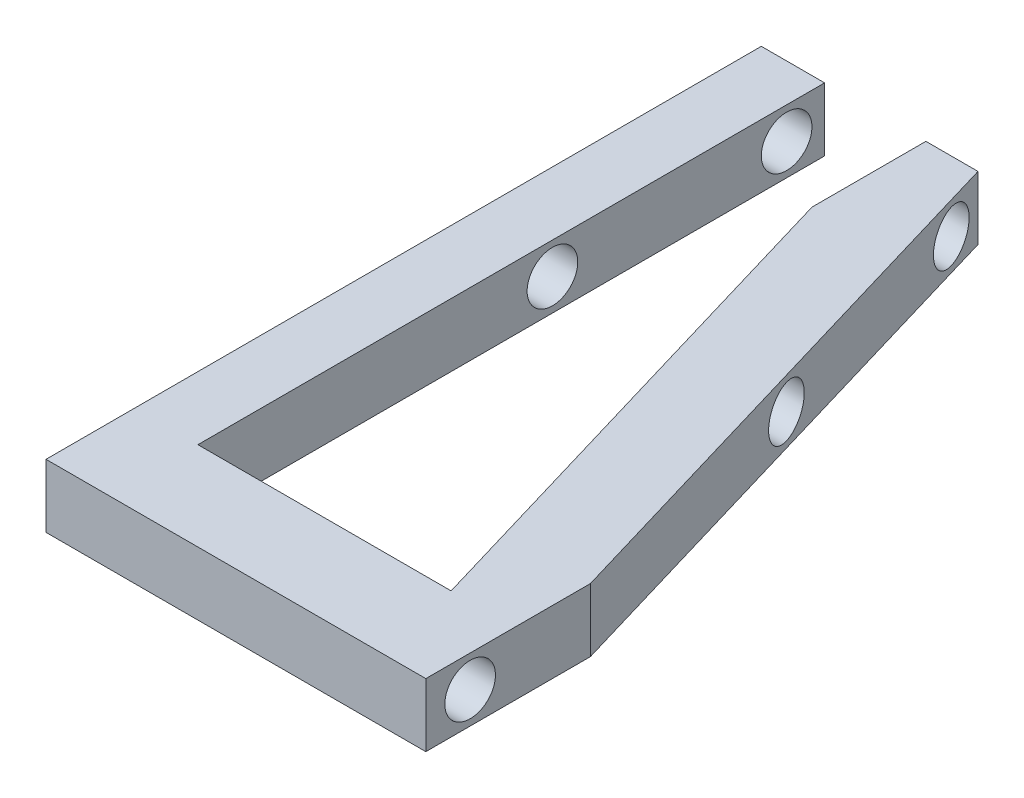
ISO-10303-21;
HEADER;
FILE_DESCRIPTION(('STEP AP214'),'2;1');
FILE_NAME('part.step','',(''),(''),'','','');
FILE_SCHEMA(('AUTOMOTIVE_DESIGN { 1 0 10303 214 1 1 1 1 }'));
ENDSEC;
DATA;
#1=APPLICATION_CONTEXT('core data for automotive mechanical design processes');
#2=APPLICATION_PROTOCOL_DEFINITION('international standard','automotive_design',2000,#1);
#3=PRODUCT_CONTEXT('',#1,'mechanical');
#4=PRODUCT('Part','Part','',(#3));
#5=PRODUCT_RELATED_PRODUCT_CATEGORY('part','',(#4));
#6=PRODUCT_DEFINITION_FORMATION('','',#4);
#7=PRODUCT_DEFINITION_CONTEXT('part definition',#1,'design');
#8=PRODUCT_DEFINITION('design','',#6,#7);
#9=PRODUCT_DEFINITION_SHAPE('','',#8);
#10=(LENGTH_UNIT() NAMED_UNIT(*) SI_UNIT(.MILLI.,.METRE.));
#11=(NAMED_UNIT(*) PLANE_ANGLE_UNIT() SI_UNIT($,.RADIAN.));
#12=(NAMED_UNIT(*) SI_UNIT($,.STERADIAN.) SOLID_ANGLE_UNIT());
#13=UNCERTAINTY_MEASURE_WITH_UNIT(LENGTH_MEASURE(1.E-05),#10,'distance_accuracy_value','');
#14=(GEOMETRIC_REPRESENTATION_CONTEXT(3) GLOBAL_UNCERTAINTY_ASSIGNED_CONTEXT((#13)) GLOBAL_UNIT_ASSIGNED_CONTEXT((#10,
#11,#12)) REPRESENTATION_CONTEXT('',''));
#15=CARTESIAN_POINT('',(0.,0.,0.));
#16=DIRECTION('',(0.,0.,1.));
#17=DIRECTION('',(1.,0.,0.));
#18=AXIS2_PLACEMENT_3D('',#15,#16,#17);
#19=CARTESIAN_POINT('',(-9.99905651846236,2.5,0.));
#20=DIRECTION('',(-1.,0.,0.));
#21=DIRECTION('',(0.,0.,1.));
#22=AXIS2_PLACEMENT_3D('',#19,#20,#21);
#23=PLANE('',#22);
#24=CARTESIAN_POINT('',(-9.99905651846236,0.,-28.));
#25=DIRECTION('',(-1.,0.,0.));
#26=DIRECTION('',(0.,0.,1.));
#27=AXIS2_PLACEMENT_3D('',#24,#25,#26);
#28=CIRCLE('',#27,2.);
#29=CARTESIAN_POINT('',(-9.99905651846236,0.,-26.));
#30=VERTEX_POINT('',#29);
#31=EDGE_CURVE('E188',#30,#30,#28,.T.);
#32=ORIENTED_EDGE('',*,*,#31,.T.);
#33=EDGE_LOOP('',(#32));
#34=FACE_BOUND('',#33,.T.);
#35=CARTESIAN_POINT('',(-9.99905651846236,0.,-46.5));
#36=DIRECTION('',(-1.,0.,0.));
#37=DIRECTION('',(0.,0.,1.));
#38=AXIS2_PLACEMENT_3D('',#35,#36,#37);
#39=CIRCLE('',#38,2.);
#40=CARTESIAN_POINT('',(-9.99905651846236,0.,-44.5));
#41=VERTEX_POINT('',#40);
#42=EDGE_CURVE('E147',#41,#41,#39,.T.);
#43=ORIENTED_EDGE('',*,*,#42,.T.);
#44=EDGE_LOOP('',(#43));
#45=FACE_BOUND('',#44,.T.);
#46=DIRECTION('',(0.,0.,-1.));
#47=VECTOR('',#46,1.);
#48=CARTESIAN_POINT('',(-9.99905651846236,-2.5,0.));
#49=LINE('',#48,#47);
#50=CARTESIAN_POINT('',(-9.99905651846236,-2.5,0.));
#51=VERTEX_POINT('',#50);
#52=CARTESIAN_POINT('',(-9.99905651846236,-2.5,-49.5));
#53=VERTEX_POINT('',#52);
#54=EDGE_CURVE('E143',#51,#53,#49,.T.);
#55=ORIENTED_EDGE('',*,*,#54,.T.);
#56=DIRECTION('',(0.,-1.,0.));
#57=VECTOR('',#56,1.);
#58=CARTESIAN_POINT('',(-9.99905651846236,2.5,-49.5));
#59=LINE('',#58,#57);
#60=CARTESIAN_POINT('',(-9.99905651846236,2.5,-49.5));
#61=VERTEX_POINT('',#60);
#62=EDGE_CURVE('E11',#61,#53,#59,.T.);
#63=ORIENTED_EDGE('',*,*,#62,.F.);
#64=DIRECTION('',(0.,0.,-1.));
#65=VECTOR('',#64,1.);
#66=CARTESIAN_POINT('',(-9.99905651846236,2.5,0.));
#67=LINE('',#66,#65);
#68=CARTESIAN_POINT('',(-9.99905651846236,2.5,0.));
#69=VERTEX_POINT('',#68);
#70=EDGE_CURVE('E162',#69,#61,#67,.T.);
#71=ORIENTED_EDGE('',*,*,#70,.F.);
#72=DIRECTION('',(0.,-1.,0.));
#73=VECTOR('',#72,1.);
#74=CARTESIAN_POINT('',(-9.99905651846236,2.5,0.));
#75=LINE('',#74,#73);
#76=EDGE_CURVE('E139',#69,#51,#75,.T.);
#77=ORIENTED_EDGE('',*,*,#76,.T.);
#78=EDGE_LOOP('',(#55,#63,#71,#77));
#79=FACE_BOUND('',#78,.T.);
#80=ADVANCED_FACE('F33',(#34,#45,#79),#23,.F.);
#81=CARTESIAN_POINT('',(-9.99905651846236,2.5,-49.5));
#82=DIRECTION('',(0.,0.,1.));
#83=DIRECTION('',(1.,0.,0.));
#84=AXIS2_PLACEMENT_3D('',#81,#82,#83);
#85=PLANE('',#84);
#86=DIRECTION('',(-1.,0.,0.));
#87=VECTOR('',#86,1.);
#88=CARTESIAN_POINT('',(-9.99905651846236,-2.5,-49.5));
#89=LINE('',#88,#87);
#90=CARTESIAN_POINT('',(-14.9990565184624,-2.5,-49.5));
#91=VERTEX_POINT('',#90);
#92=EDGE_CURVE('E146',#53,#91,#89,.T.);
#93=ORIENTED_EDGE('',*,*,#92,.T.);
#94=DIRECTION('',(0.,-1.,0.));
#95=VECTOR('',#94,1.);
#96=CARTESIAN_POINT('',(-14.9990565184624,2.5,-49.5));
#97=LINE('',#96,#95);
#98=CARTESIAN_POINT('',(-14.9990565184624,2.5,-49.5));
#99=VERTEX_POINT('',#98);
#100=EDGE_CURVE('E42',#99,#91,#97,.T.);
#101=ORIENTED_EDGE('',*,*,#100,.F.);
#102=DIRECTION('',(-1.,0.,0.));
#103=VECTOR('',#102,1.);
#104=CARTESIAN_POINT('',(-9.99905651846236,2.5,-49.5));
#105=LINE('',#104,#103);
#106=EDGE_CURVE('E100',#61,#99,#105,.T.);
#107=ORIENTED_EDGE('',*,*,#106,.F.);
#108=ORIENTED_EDGE('',*,*,#62,.T.);
#109=EDGE_LOOP('',(#93,#101,#107,#108));
#110=FACE_BOUND('',#109,.T.);
#111=ADVANCED_FACE('F237',(#110),#85,.F.);
#112=CARTESIAN_POINT('',(-14.9990565184624,2.5,-49.5));
#113=DIRECTION('',(1.,0.,0.));
#114=DIRECTION('',(0.,0.,-1.));
#115=AXIS2_PLACEMENT_3D('',#112,#113,#114);
#116=PLANE('',#115);
#117=CARTESIAN_POINT('',(-14.9990565184624,0.,-28.));
#118=DIRECTION('',(-1.,0.,0.));
#119=DIRECTION('',(0.,0.,1.));
#120=AXIS2_PLACEMENT_3D('',#117,#118,#119);
#121=CIRCLE('',#120,2.);
#122=CARTESIAN_POINT('',(-14.9990565184624,0.,-26.));
#123=VERTEX_POINT('',#122);
#124=EDGE_CURVE('E308',#123,#123,#121,.T.);
#125=ORIENTED_EDGE('',*,*,#124,.F.);
#126=EDGE_LOOP('',(#125));
#127=FACE_BOUND('',#126,.T.);
#128=CARTESIAN_POINT('',(-14.9990565184624,0.,3.5));
#129=DIRECTION('',(-1.,0.,0.));
#130=DIRECTION('',(0.,0.,1.));
#131=AXIS2_PLACEMENT_3D('',#128,#129,#130);
#132=CIRCLE('',#131,2.);
#133=CARTESIAN_POINT('',(-14.9990565184624,0.,5.5));
#134=VERTEX_POINT('',#133);
#135=EDGE_CURVE('E314',#134,#134,#132,.T.);
#136=ORIENTED_EDGE('',*,*,#135,.F.);
#137=EDGE_LOOP('',(#136));
#138=FACE_BOUND('',#137,.T.);
#139=CARTESIAN_POINT('',(-14.9990565184624,0.,-46.5));
#140=DIRECTION('',(-1.,0.,0.));
#141=DIRECTION('',(0.,0.,1.));
#142=AXIS2_PLACEMENT_3D('',#139,#140,#141);
#143=CIRCLE('',#142,2.);
#144=CARTESIAN_POINT('',(-14.9990565184624,0.,-44.5));
#145=VERTEX_POINT('',#144);
#146=EDGE_CURVE('E182',#145,#145,#143,.T.);
#147=ORIENTED_EDGE('',*,*,#146,.F.);
#148=EDGE_LOOP('',(#147));
#149=FACE_BOUND('',#148,.T.);
#150=DIRECTION('',(0.,0.,1.));
#151=VECTOR('',#150,1.);
#152=CARTESIAN_POINT('',(-14.9990565184624,-2.5,-49.5));
#153=LINE('',#152,#151);
#154=CARTESIAN_POINT('',(-14.9990565184624,-2.5,7.));
#155=VERTEX_POINT('',#154);
#156=EDGE_CURVE('E149',#91,#155,#153,.T.);
#157=ORIENTED_EDGE('',*,*,#156,.T.);
#158=DIRECTION('',(0.,-1.,0.));
#159=VECTOR('',#158,1.);
#160=CARTESIAN_POINT('',(-14.9990565184624,2.5,7.));
#161=LINE('',#160,#159);
#162=CARTESIAN_POINT('',(-14.9990565184624,2.5,7.));
#163=VERTEX_POINT('',#162);
#164=EDGE_CURVE('E175',#163,#155,#161,.T.);
#165=ORIENTED_EDGE('',*,*,#164,.F.);
#166=DIRECTION('',(0.,0.,1.));
#167=VECTOR('',#166,1.);
#168=CARTESIAN_POINT('',(-14.9990565184624,2.5,-49.5));
#169=LINE('',#168,#167);
#170=EDGE_CURVE('E201',#99,#163,#169,.T.);
#171=ORIENTED_EDGE('',*,*,#170,.F.);
#172=ORIENTED_EDGE('',*,*,#100,.T.);
#173=EDGE_LOOP('',(#157,#165,#171,#172));
#174=FACE_BOUND('',#173,.T.);
#175=ADVANCED_FACE('F242',(#127,#138,#149,#174),#116,.F.);
#176=CARTESIAN_POINT('',(-14.9990565184624,2.5,7.));
#177=DIRECTION('',(0.,0.,-1.));
#178=DIRECTION('',(-1.,0.,0.));
#179=AXIS2_PLACEMENT_3D('',#176,#177,#178);
#180=PLANE('',#179);
#181=DIRECTION('',(1.,0.,0.));
#182=VECTOR('',#181,1.);
#183=CARTESIAN_POINT('',(-14.9990565184624,-2.5,7.));
#184=LINE('',#183,#182);
#185=CARTESIAN_POINT('',(15.0009434815376,-2.5,7.));
#186=VERTEX_POINT('',#185);
#187=EDGE_CURVE('E151',#155,#186,#184,.T.);
#188=ORIENTED_EDGE('',*,*,#187,.T.);
#189=DIRECTION('',(0.,-1.,0.));
#190=VECTOR('',#189,1.);
#191=CARTESIAN_POINT('',(15.0009434815376,2.5,7.));
#192=LINE('',#191,#190);
#193=CARTESIAN_POINT('',(15.0009434815376,2.5,7.));
#194=VERTEX_POINT('',#193);
#195=EDGE_CURVE('E172',#194,#186,#192,.T.);
#196=ORIENTED_EDGE('',*,*,#195,.F.);
#197=DIRECTION('',(1.,0.,0.));
#198=VECTOR('',#197,1.);
#199=CARTESIAN_POINT('',(-14.9990565184624,2.5,7.));
#200=LINE('',#199,#198);
#201=EDGE_CURVE('E203',#163,#194,#200,.T.);
#202=ORIENTED_EDGE('',*,*,#201,.F.);
#203=ORIENTED_EDGE('',*,*,#164,.T.);
#204=EDGE_LOOP('',(#188,#196,#202,#203));
#205=FACE_BOUND('',#204,.T.);
#206=ADVANCED_FACE('F333',(#205),#180,.F.);
#207=CARTESIAN_POINT('',(15.0009434815376,2.5,7.));
#208=DIRECTION('',(-1.,0.,0.));
#209=DIRECTION('',(0.,0.,1.));
#210=AXIS2_PLACEMENT_3D('',#207,#208,#209);
#211=PLANE('',#210);
#212=CARTESIAN_POINT('',(15.0009434815376,0.,3.5));
#213=DIRECTION('',(-1.,0.,0.));
#214=DIRECTION('',(0.,0.,1.));
#215=AXIS2_PLACEMENT_3D('',#212,#213,#214);
#216=CIRCLE('',#215,2.);
#217=CARTESIAN_POINT('',(15.0009434815376,0.,5.50000000000001));
#218=VERTEX_POINT('',#217);
#219=EDGE_CURVE('E310',#218,#218,#216,.F.);
#220=ORIENTED_EDGE('',*,*,#219,.F.);
#221=EDGE_LOOP('',(#220));
#222=FACE_BOUND('',#221,.T.);
#223=DIRECTION('',(0.,0.,-1.));
#224=VECTOR('',#223,1.);
#225=CARTESIAN_POINT('',(15.0009434815376,-2.5,7.));
#226=LINE('',#225,#224);
#227=CARTESIAN_POINT('',(15.0009434815376,-2.5,-6.));
#228=VERTEX_POINT('',#227);
#229=EDGE_CURVE('E153',#186,#228,#226,.T.);
#230=ORIENTED_EDGE('',*,*,#229,.T.);
#231=DIRECTION('',(0.,-1.,0.));
#232=VECTOR('',#231,1.);
#233=CARTESIAN_POINT('',(15.0009434815376,2.5,-6.));
#234=LINE('',#233,#232);
#235=CARTESIAN_POINT('',(15.0009434815376,2.5,-6.));
#236=VERTEX_POINT('',#235);
#237=EDGE_CURVE('E169',#236,#228,#234,.T.);
#238=ORIENTED_EDGE('',*,*,#237,.F.);
#239=DIRECTION('',(0.,0.,-1.));
#240=VECTOR('',#239,1.);
#241=CARTESIAN_POINT('',(15.0009434815376,2.5,7.));
#242=LINE('',#241,#240);
#243=EDGE_CURVE('E205',#194,#236,#242,.T.);
#244=ORIENTED_EDGE('',*,*,#243,.F.);
#245=ORIENTED_EDGE('',*,*,#195,.T.);
#246=EDGE_LOOP('',(#230,#238,#244,#245));
#247=FACE_BOUND('',#246,.T.);
#248=ADVANCED_FACE('F324',(#222,#247),#211,.F.);
#249=CARTESIAN_POINT('',(15.0009434815376,2.5,-6.));
#250=DIRECTION('',(-0.958819734868195,0.,0.284015344703917));
#251=DIRECTION('',(0.284015344703917,0.,0.958819734868195));
#252=AXIS2_PLACEMENT_3D('',#249,#250,#251);
#253=PLANE('',#252);
#254=CARTESIAN_POINT('',(8.48424659237201,0.,-28.));
#255=DIRECTION('',(-0.958819734868195,0.,0.284015344703917));
#256=DIRECTION('',(-0.284015344703917,0.,-0.958819734868195));
#257=AXIS2_PLACEMENT_3D('',#254,#255,#256);
#258=ELLIPSE('',#257,2.0858978254916,2.);
#259=CARTESIAN_POINT('',(7.89181960244786,0.,-30.));
#260=VERTEX_POINT('',#259);
#261=EDGE_CURVE('E193',#260,#260,#258,.T.);
#262=ORIENTED_EDGE('',*,*,#261,.T.);
#263=EDGE_LOOP('',(#262));
#264=FACE_BOUND('',#263,.T.);
#265=CARTESIAN_POINT('',(3.00429693557366,0.,-46.5));
#266=DIRECTION('',(-0.958819734868195,0.,0.284015344703917));
#267=DIRECTION('',(-0.284015344703917,0.,-0.958819734868195));
#268=AXIS2_PLACEMENT_3D('',#265,#266,#267);
#269=ELLIPSE('',#268,2.0858978254916,2.);
#270=CARTESIAN_POINT('',(2.41186994564951,0.,-48.5));
#271=VERTEX_POINT('',#270);
#272=EDGE_CURVE('E181',#271,#271,#269,.T.);
#273=ORIENTED_EDGE('',*,*,#272,.T.);
#274=EDGE_LOOP('',(#273));
#275=FACE_BOUND('',#274,.T.);
#276=DIRECTION('',(-0.284015344703917,0.,-0.958819734868195));
#277=VECTOR('',#276,1.);
#278=CARTESIAN_POINT('',(15.0009434815376,-2.5,-6.));
#279=LINE('',#278,#277);
#280=CARTESIAN_POINT('',(2.11565645068743,-2.5,-49.5));
#281=VERTEX_POINT('',#280);
#282=EDGE_CURVE('E155',#228,#281,#279,.T.);
#283=ORIENTED_EDGE('',*,*,#282,.T.);
#284=DIRECTION('',(0.,-1.,0.));
#285=VECTOR('',#284,1.);
#286=CARTESIAN_POINT('',(2.11565645068743,2.5,-49.5));
#287=LINE('',#286,#285);
#288=CARTESIAN_POINT('',(2.11565645068743,2.5,-49.5));
#289=VERTEX_POINT('',#288);
#290=EDGE_CURVE('E166',#289,#281,#287,.T.);
#291=ORIENTED_EDGE('',*,*,#290,.F.);
#292=DIRECTION('',(-0.284015344703917,0.,-0.958819734868195));
#293=VECTOR('',#292,1.);
#294=CARTESIAN_POINT('',(15.0009434815376,2.5,-6.));
#295=LINE('',#294,#293);
#296=EDGE_CURVE('E207',#236,#289,#295,.T.);
#297=ORIENTED_EDGE('',*,*,#296,.F.);
#298=ORIENTED_EDGE('',*,*,#237,.T.);
#299=EDGE_LOOP('',(#283,#291,#297,#298));
#300=FACE_BOUND('',#299,.T.);
#301=ADVANCED_FACE('F213',(#264,#275,#300),#253,.F.);
#302=CARTESIAN_POINT('',(2.11565645068743,2.5,-49.5));
#303=DIRECTION('',(0.,0.,1.));
#304=DIRECTION('',(1.,0.,0.));
#305=AXIS2_PLACEMENT_3D('',#302,#303,#304);
#306=PLANE('',#305);
#307=DIRECTION('',(-1.,0.,0.));
#308=VECTOR('',#307,1.);
#309=CARTESIAN_POINT('',(2.11565645068743,-2.5,-49.5));
#310=LINE('',#309,#308);
#311=CARTESIAN_POINT('',(-1.99905651846236,-2.5,-49.5));
#312=VERTEX_POINT('',#311);
#313=EDGE_CURVE('E157',#281,#312,#310,.T.);
#314=ORIENTED_EDGE('',*,*,#313,.T.);
#315=DIRECTION('',(0.,-1.,0.));
#316=VECTOR('',#315,1.);
#317=CARTESIAN_POINT('',(-1.99905651846236,2.5,-49.5));
#318=LINE('',#317,#316);
#319=CARTESIAN_POINT('',(-1.99905651846236,2.5,-49.5));
#320=VERTEX_POINT('',#319);
#321=EDGE_CURVE('E134',#320,#312,#318,.T.);
#322=ORIENTED_EDGE('',*,*,#321,.F.);
#323=DIRECTION('',(-1.,0.,0.));
#324=VECTOR('',#323,1.);
#325=CARTESIAN_POINT('',(2.11565645068743,2.5,-49.5));
#326=LINE('',#325,#324);
#327=EDGE_CURVE('E125',#289,#320,#326,.T.);
#328=ORIENTED_EDGE('',*,*,#327,.F.);
#329=ORIENTED_EDGE('',*,*,#290,.T.);
#330=EDGE_LOOP('',(#314,#322,#328,#329));
#331=FACE_BOUND('',#330,.T.);
#332=ADVANCED_FACE('F217',(#331),#306,.F.);
#333=CARTESIAN_POINT('',(-1.99905651846236,2.5,-49.5));
#334=DIRECTION('',(1.,0.,0.));
#335=DIRECTION('',(0.,0.,-1.));
#336=AXIS2_PLACEMENT_3D('',#333,#334,#335);
#337=PLANE('',#336);
#338=CARTESIAN_POINT('',(-1.99905651846236,0.,-46.5));
#339=DIRECTION('',(1.,0.,0.));
#340=DIRECTION('',(0.,0.,-1.));
#341=AXIS2_PLACEMENT_3D('',#338,#339,#340);
#342=CIRCLE('',#341,2.);
#343=CARTESIAN_POINT('',(-1.99905651846236,0.,-48.5));
#344=VERTEX_POINT('',#343);
#345=EDGE_CURVE('E179',#344,#344,#342,.T.);
#346=ORIENTED_EDGE('',*,*,#345,.T.);
#347=EDGE_LOOP('',(#346));
#348=FACE_BOUND('',#347,.T.);
#349=DIRECTION('',(0.,0.,1.));
#350=VECTOR('',#349,1.);
#351=CARTESIAN_POINT('',(-1.99905651846236,-2.5,-49.5));
#352=LINE('',#351,#350);
#353=CARTESIAN_POINT('',(-1.99905651846236,-2.5,-40.5049507905132));
#354=VERTEX_POINT('',#353);
#355=EDGE_CURVE('E133',#312,#354,#352,.T.);
#356=ORIENTED_EDGE('',*,*,#355,.T.);
#357=DIRECTION('',(0.,-1.,0.));
#358=VECTOR('',#357,1.);
#359=CARTESIAN_POINT('',(-1.99905651846236,2.5,-40.5049507905132));
#360=LINE('',#359,#358);
#361=CARTESIAN_POINT('',(-1.99905651846236,2.5,-40.5049507905132));
#362=VERTEX_POINT('',#361);
#363=EDGE_CURVE('E130',#362,#354,#360,.T.);
#364=ORIENTED_EDGE('',*,*,#363,.F.);
#365=DIRECTION('',(0.,0.,1.));
#366=VECTOR('',#365,1.);
#367=CARTESIAN_POINT('',(-1.99905651846236,2.5,-49.5));
#368=LINE('',#367,#366);
#369=EDGE_CURVE('E119',#320,#362,#368,.T.);
#370=ORIENTED_EDGE('',*,*,#369,.F.);
#371=ORIENTED_EDGE('',*,*,#321,.T.);
#372=EDGE_LOOP('',(#356,#364,#370,#371));
#373=FACE_BOUND('',#372,.T.);
#374=ADVANCED_FACE('F131',(#348,#373),#337,.F.);
#375=CARTESIAN_POINT('',(-1.99905651846236,2.5,-40.5049507905132));
#376=DIRECTION('',(0.958819734868195,0.,-0.284015344703917));
#377=DIRECTION('',(-0.284015344703917,0.,-0.958819734868195));
#378=AXIS2_PLACEMENT_3D('',#375,#376,#377);
#379=PLANE('',#378);
#380=CARTESIAN_POINT('',(1.70507865952431,0.,-28.));
#381=DIRECTION('',(0.958819734868195,0.,-0.284015344703917));
#382=DIRECTION('',(-0.284015344703917,0.,-0.958819734868195));
#383=AXIS2_PLACEMENT_3D('',#380,#381,#382);
#384=ELLIPSE('',#383,2.0858978254916,2.);
#385=CARTESIAN_POINT('',(1.11265166960017,0.,-30.));
#386=VERTEX_POINT('',#385);
#387=EDGE_CURVE('E36',#386,#386,#384,.T.);
#388=ORIENTED_EDGE('',*,*,#387,.T.);
#389=EDGE_LOOP('',(#388));
#390=FACE_BOUND('',#389,.T.);
#391=DIRECTION('',(0.284015344703917,0.,0.958819734868195));
#392=VECTOR('',#391,1.);
#393=CARTESIAN_POINT('',(-1.99905651846236,-2.5,-40.5049507905132));
#394=LINE('',#393,#392);
#395=CARTESIAN_POINT('',(9.99905651846236,-2.5,0.));
#396=VERTEX_POINT('',#395);
#397=EDGE_CURVE('E86',#354,#396,#394,.T.);
#398=ORIENTED_EDGE('',*,*,#397,.T.);
#399=DIRECTION('',(0.,-1.,0.));
#400=VECTOR('',#399,1.);
#401=CARTESIAN_POINT('',(9.99905651846236,2.5,0.));
#402=LINE('',#401,#400);
#403=CARTESIAN_POINT('',(9.99905651846236,2.5,0.));
#404=VERTEX_POINT('',#403);
#405=EDGE_CURVE('E135',#404,#396,#402,.T.);
#406=ORIENTED_EDGE('',*,*,#405,.F.);
#407=DIRECTION('',(0.284015344703917,0.,0.958819734868195));
#408=VECTOR('',#407,1.);
#409=CARTESIAN_POINT('',(-1.99905651846236,2.5,-40.5049507905132));
#410=LINE('',#409,#408);
#411=EDGE_CURVE('E123',#362,#404,#410,.T.);
#412=ORIENTED_EDGE('',*,*,#411,.F.);
#413=ORIENTED_EDGE('',*,*,#363,.T.);
#414=EDGE_LOOP('',(#398,#406,#412,#413));
#415=FACE_BOUND('',#414,.T.);
#416=ADVANCED_FACE('F137',(#390,#415),#379,.F.);
#417=CARTESIAN_POINT('',(9.99905651846236,2.5,0.));
#418=DIRECTION('',(0.,0.,1.));
#419=DIRECTION('',(1.,0.,0.));
#420=AXIS2_PLACEMENT_3D('',#417,#418,#419);
#421=PLANE('',#420);
#422=DIRECTION('',(-1.,0.,0.));
#423=VECTOR('',#422,1.);
#424=CARTESIAN_POINT('',(9.99905651846236,-2.5,0.));
#425=LINE('',#424,#423);
#426=EDGE_CURVE('E92',#396,#51,#425,.T.);
#427=ORIENTED_EDGE('',*,*,#426,.T.);
#428=ORIENTED_EDGE('',*,*,#76,.F.);
#429=DIRECTION('',(-1.,0.,0.));
#430=VECTOR('',#429,1.);
#431=CARTESIAN_POINT('',(9.99905651846236,2.5,0.));
#432=LINE('',#431,#430);
#433=EDGE_CURVE('E51',#404,#69,#432,.T.);
#434=ORIENTED_EDGE('',*,*,#433,.F.);
#435=ORIENTED_EDGE('',*,*,#405,.T.);
#436=EDGE_LOOP('',(#427,#428,#434,#435));
#437=FACE_BOUND('',#436,.T.);
#438=ADVANCED_FACE('F225',(#437),#421,.F.);
#439=CARTESIAN_POINT('',(0.,2.5,0.));
#440=DIRECTION('',(0.,1.,0.));
#441=DIRECTION('',(0.,0.,1.));
#442=AXIS2_PLACEMENT_3D('',#439,#440,#441);
#443=PLANE('',#442);
#444=ORIENTED_EDGE('',*,*,#70,.T.);
#445=ORIENTED_EDGE('',*,*,#106,.T.);
#446=ORIENTED_EDGE('',*,*,#170,.T.);
#447=ORIENTED_EDGE('',*,*,#201,.T.);
#448=ORIENTED_EDGE('',*,*,#243,.T.);
#449=ORIENTED_EDGE('',*,*,#296,.T.);
#450=ORIENTED_EDGE('',*,*,#327,.T.);
#451=ORIENTED_EDGE('',*,*,#369,.T.);
#452=ORIENTED_EDGE('',*,*,#411,.T.);
#453=ORIENTED_EDGE('',*,*,#433,.T.);
#454=EDGE_LOOP('',(#444,#445,#446,#447,#448,#449,#450,#451,#452,#453));
#455=FACE_BOUND('',#454,.T.);
#456=ADVANCED_FACE('F121',(#455),#443,.T.);
#457=CARTESIAN_POINT('',(0.,-2.5,0.));
#458=DIRECTION('',(0.,1.,0.));
#459=DIRECTION('',(0.,0.,1.));
#460=AXIS2_PLACEMENT_3D('',#457,#458,#459);
#461=PLANE('',#460);
#462=ORIENTED_EDGE('',*,*,#54,.F.);
#463=ORIENTED_EDGE('',*,*,#426,.F.);
#464=ORIENTED_EDGE('',*,*,#397,.F.);
#465=ORIENTED_EDGE('',*,*,#355,.F.);
#466=ORIENTED_EDGE('',*,*,#313,.F.);
#467=ORIENTED_EDGE('',*,*,#282,.F.);
#468=ORIENTED_EDGE('',*,*,#229,.F.);
#469=ORIENTED_EDGE('',*,*,#187,.F.);
#470=ORIENTED_EDGE('',*,*,#156,.F.);
#471=ORIENTED_EDGE('',*,*,#92,.F.);
#472=EDGE_LOOP('',(#462,#463,#464,#465,#466,#467,#468,#469,#470,#471));
#473=FACE_BOUND('',#472,.T.);
#474=ADVANCED_FACE('F220',(#473),#461,.F.);
#475=CARTESIAN_POINT('',(20.65779773103,0.,-46.5));
#476=DIRECTION('',(-1.,0.,0.));
#477=DIRECTION('',(0.,0.,1.));
#478=AXIS2_PLACEMENT_3D('',#475,#476,#477);
#479=CYLINDRICAL_SURFACE('',#478,2.);
#480=ORIENTED_EDGE('',*,*,#345,.F.);
#481=EDGE_LOOP('',(#480));
#482=FACE_BOUND('',#481,.T.);
#483=ORIENTED_EDGE('',*,*,#272,.F.);
#484=EDGE_LOOP('',(#483));
#485=FACE_BOUND('',#484,.T.);
#486=ADVANCED_FACE('F250',(#482,#485),#479,.F.);
#487=ORIENTED_EDGE('',*,*,#146,.T.);
#488=EDGE_LOOP('',(#487));
#489=FACE_BOUND('',#488,.T.);
#490=ORIENTED_EDGE('',*,*,#42,.F.);
#491=EDGE_LOOP('',(#490));
#492=FACE_BOUND('',#491,.T.);
#493=ADVANCED_FACE('F247',(#489,#492),#479,.F.);
#494=CARTESIAN_POINT('',(20.65779773103,0.,-28.));
#495=DIRECTION('',(-1.,0.,0.));
#496=DIRECTION('',(0.,0.,1.));
#497=AXIS2_PLACEMENT_3D('',#494,#495,#496);
#498=CYLINDRICAL_SURFACE('',#497,2.);
#499=ORIENTED_EDGE('',*,*,#387,.F.);
#500=EDGE_LOOP('',(#499));
#501=FACE_BOUND('',#500,.T.);
#502=ORIENTED_EDGE('',*,*,#261,.F.);
#503=EDGE_LOOP('',(#502));
#504=FACE_BOUND('',#503,.T.);
#505=ADVANCED_FACE('F249',(#501,#504),#498,.F.);
#506=CARTESIAN_POINT('',(20.65779773103,0.,3.50000000000001));
#507=DIRECTION('',(-1.,0.,0.));
#508=DIRECTION('',(0.,0.,1.));
#509=AXIS2_PLACEMENT_3D('',#506,#507,#508);
#510=CYLINDRICAL_SURFACE('',#509,2.);
#511=ORIENTED_EDGE('',*,*,#219,.T.);
#512=EDGE_LOOP('',(#511));
#513=FACE_BOUND('',#512,.T.);
#514=ORIENTED_EDGE('',*,*,#135,.T.);
#515=EDGE_LOOP('',(#514));
#516=FACE_BOUND('',#515,.T.);
#517=ADVANCED_FACE('F256',(#513,#516),#510,.F.);
#518=ORIENTED_EDGE('',*,*,#124,.T.);
#519=EDGE_LOOP('',(#518));
#520=FACE_BOUND('',#519,.T.);
#521=ORIENTED_EDGE('',*,*,#31,.F.);
#522=EDGE_LOOP('',(#521));
#523=FACE_BOUND('',#522,.T.);
#524=ADVANCED_FACE('F259',(#520,#523),#498,.F.);
#525=CLOSED_SHELL('',(#80,#111,#175,#206,#248,#301,#332,#374,#416,#438,#456,#474,#486,#493,#505,
#517,#524));
#526=MANIFOLD_SOLID_BREP('B2',#525);
#527=ADVANCED_BREP_SHAPE_REPRESENTATION('',(#18,#526),#14);
#528=SHAPE_DEFINITION_REPRESENTATION(#9,#527);
ENDSEC;
END-ISO-10303-21;
